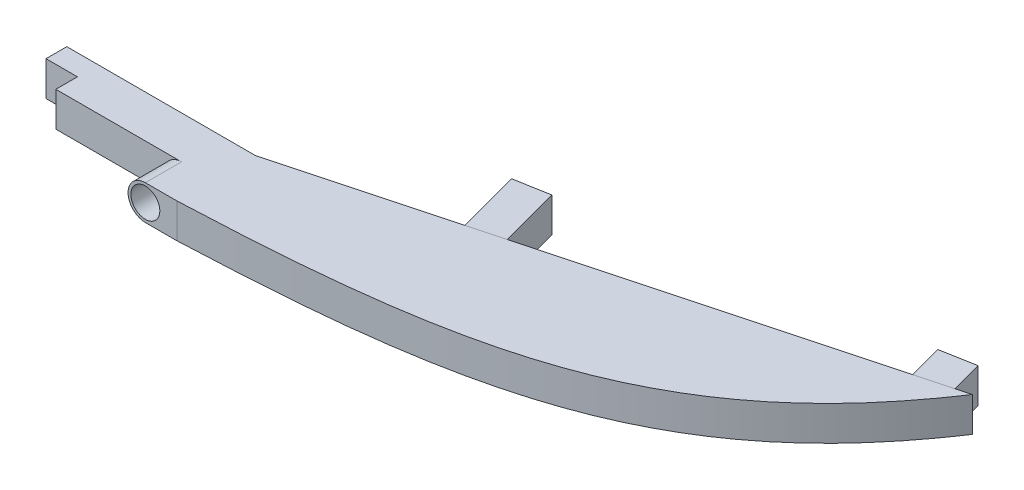
ISO-10303-21;
HEADER;
FILE_DESCRIPTION(('STEP AP214'),'2;1');
FILE_NAME('part.step','',(''),(''),'','','');
FILE_SCHEMA(('AUTOMOTIVE_DESIGN { 1 0 10303 214 1 1 1 1 }'));
ENDSEC;
DATA;
#1=APPLICATION_CONTEXT('core data for automotive mechanical design processes');
#2=APPLICATION_PROTOCOL_DEFINITION('international standard','automotive_design',2000,#1);
#3=PRODUCT_CONTEXT('',#1,'mechanical');
#4=PRODUCT('Part','Part','',(#3));
#5=PRODUCT_RELATED_PRODUCT_CATEGORY('part','',(#4));
#6=PRODUCT_DEFINITION_FORMATION('','',#4);
#7=PRODUCT_DEFINITION_CONTEXT('part definition',#1,'design');
#8=PRODUCT_DEFINITION('design','',#6,#7);
#9=PRODUCT_DEFINITION_SHAPE('','',#8);
#10=(LENGTH_UNIT() NAMED_UNIT(*) SI_UNIT(.MILLI.,.METRE.));
#11=(NAMED_UNIT(*) PLANE_ANGLE_UNIT() SI_UNIT($,.RADIAN.));
#12=(NAMED_UNIT(*) SI_UNIT($,.STERADIAN.) SOLID_ANGLE_UNIT());
#13=UNCERTAINTY_MEASURE_WITH_UNIT(LENGTH_MEASURE(1.E-05),#10,'distance_accuracy_value','');
#14=(GEOMETRIC_REPRESENTATION_CONTEXT(3) GLOBAL_UNCERTAINTY_ASSIGNED_CONTEXT((#13)) GLOBAL_UNIT_ASSIGNED_CONTEXT((#10,
#11,#12)) REPRESENTATION_CONTEXT('',''));
#15=CARTESIAN_POINT('',(0.,0.,0.));
#16=DIRECTION('',(0.,0.,1.));
#17=DIRECTION('',(1.,0.,0.));
#18=AXIS2_PLACEMENT_3D('',#15,#16,#17);
#19=CARTESIAN_POINT('',(-3.12500000003779,0.,-11.6626587736309));
#20=DIRECTION('',(-0.258819045105893,0.,-0.965925826288165));
#21=DIRECTION('',(-0.965925826288165,0.,0.258819045105893));
#22=AXIS2_PLACEMENT_3D('',#19,#20,#21);
#23=PLANE('',#22);
#24=DIRECTION('',(-0.965925826288165,0.,0.258819045105893));
#25=VECTOR('',#24,1.);
#26=CARTESIAN_POINT('',(-3.12500000003779,5.5,-11.6626587736309));
#27=LINE('',#26,#25);
#28=CARTESIAN_POINT('',(31.6340708109374,5.5,-20.976323727218));
#29=VERTEX_POINT('',#28);
#30=CARTESIAN_POINT('',(26.3214787663525,5.5,-19.5528189791356));
#31=VERTEX_POINT('',#30);
#32=EDGE_CURVE('E110',#29,#31,#27,.T.);
#33=ORIENTED_EDGE('',*,*,#32,.T.);
#34=DIRECTION('',(0.,1.,0.));
#35=VECTOR('',#34,1.);
#36=CARTESIAN_POINT('',(26.3214787663525,0.,-19.5528189791356));
#37=LINE('',#36,#35);
#38=CARTESIAN_POINT('',(26.3214787663525,0.,-19.5528189791356));
#39=VERTEX_POINT('',#38);
#40=EDGE_CURVE('E12',#39,#31,#37,.T.);
#41=ORIENTED_EDGE('',*,*,#40,.F.);
#42=DIRECTION('',(-0.965925826288165,0.,0.258819045105893));
#43=VECTOR('',#42,1.);
#44=CARTESIAN_POINT('',(-3.12500000003779,0.,-11.6626587736309));
#45=LINE('',#44,#43);
#46=CARTESIAN_POINT('',(31.6340708109374,0.,-20.976323727218));
#47=VERTEX_POINT('',#46);
#48=EDGE_CURVE('E105',#47,#39,#45,.T.);
#49=ORIENTED_EDGE('',*,*,#48,.F.);
#50=DIRECTION('',(0.,1.,0.));
#51=VECTOR('',#50,1.);
#52=CARTESIAN_POINT('',(31.6340708109374,0.,-20.976323727218));
#53=LINE('',#52,#51);
#54=EDGE_CURVE('E49',#47,#29,#53,.T.);
#55=ORIENTED_EDGE('',*,*,#54,.T.);
#56=EDGE_LOOP('',(#33,#41,#49,#55));
#57=FACE_BOUND('',#56,.T.);
#58=ADVANCED_FACE('F46',(#57),#23,.F.);
#59=CARTESIAN_POINT('',(29.4464787663903,0.,-7.89016020550466));
#60=DIRECTION('',(0.965925826288165,0.,-0.258819045105893));
#61=DIRECTION('',(-0.258819045105893,0.,-0.965925826288165));
#62=AXIS2_PLACEMENT_3D('',#59,#60,#61);
#63=PLANE('',#62);
#64=DIRECTION('',(-0.258819045105893,0.,-0.965925826288165));
#65=VECTOR('',#64,1.);
#66=CARTESIAN_POINT('',(29.4464787663903,5.5,-7.89016020550466));
#67=LINE('',#66,#65);
#68=CARTESIAN_POINT('',(23.6067214539603,5.5,-29.6844311990608));
#69=VERTEX_POINT('',#68);
#70=EDGE_CURVE('E85',#31,#69,#67,.T.);
#71=ORIENTED_EDGE('',*,*,#70,.T.);
#72=DIRECTION('',(0.,1.,0.));
#73=VECTOR('',#72,1.);
#74=CARTESIAN_POINT('',(23.6067214539603,0.,-29.6844311990608));
#75=LINE('',#74,#73);
#76=CARTESIAN_POINT('',(23.6067214539603,0.,-29.6844311990608));
#77=VERTEX_POINT('',#76);
#78=EDGE_CURVE('E55',#77,#69,#75,.T.);
#79=ORIENTED_EDGE('',*,*,#78,.F.);
#80=DIRECTION('',(-0.258819045105893,0.,-0.965925826288165));
#81=VECTOR('',#80,1.);
#82=CARTESIAN_POINT('',(29.4464787663903,0.,-7.89016020550466));
#83=LINE('',#82,#81);
#84=EDGE_CURVE('E63',#39,#77,#83,.T.);
#85=ORIENTED_EDGE('',*,*,#84,.F.);
#86=ORIENTED_EDGE('',*,*,#40,.T.);
#87=EDGE_LOOP('',(#71,#79,#85,#86));
#88=FACE_BOUND('',#87,.T.);
#89=ADVANCED_FACE('F117',(#88),#63,.F.);
#90=CARTESIAN_POINT('',(-4.44710939388558,0.,-24.6163093787516));
#91=DIRECTION('',(-0.177779237001607,0.,-0.984070395292495));
#92=DIRECTION('',(-0.984070395292495,0.,0.177779237001607));
#93=AXIS2_PLACEMENT_3D('',#90,#91,#92);
#94=PLANE('',#93);
#95=DIRECTION('',(-0.984070395292495,0.,0.177779237001607));
#96=VECTOR('',#95,1.);
#97=CARTESIAN_POINT('',(-4.44710939388558,5.5,-24.6163093787516));
#98=LINE('',#97,#96);
#99=CARTESIAN_POINT('',(29.0378369496948,5.5,-30.6656004055709));
#100=VERTEX_POINT('',#99);
#101=EDGE_CURVE('E97',#100,#69,#98,.T.);
#102=ORIENTED_EDGE('',*,*,#101,.F.);
#103=DIRECTION('',(0.,1.,0.));
#104=VECTOR('',#103,1.);
#105=CARTESIAN_POINT('',(29.0378369496948,0.,-30.6656004055709));
#106=LINE('',#105,#104);
#107=CARTESIAN_POINT('',(29.0378369496948,0.,-30.6656004055709));
#108=VERTEX_POINT('',#107);
#109=EDGE_CURVE('E93',#108,#100,#106,.T.);
#110=ORIENTED_EDGE('',*,*,#109,.F.);
#111=DIRECTION('',(-0.984070395292495,0.,0.177779237001607));
#112=VECTOR('',#111,1.);
#113=CARTESIAN_POINT('',(-4.44710939388558,0.,-24.6163093787516));
#114=LINE('',#113,#112);
#115=EDGE_CURVE('E96',#108,#77,#114,.T.);
#116=ORIENTED_EDGE('',*,*,#115,.T.);
#117=ORIENTED_EDGE('',*,*,#78,.T.);
#118=EDGE_LOOP('',(#102,#110,#116,#117));
#119=FACE_BOUND('',#118,.T.);
#120=ADVANCED_FACE('F95',(#119),#94,.T.);
#121=CARTESIAN_POINT('',(34.7590708109752,0.,-9.31366495358706));
#122=DIRECTION('',(0.965925826288165,0.,-0.258819045105893));
#123=DIRECTION('',(-0.258819045105893,0.,-0.965925826288165));
#124=AXIS2_PLACEMENT_3D('',#121,#122,#123);
#125=PLANE('',#124);
#126=DIRECTION('',(-0.258819045105893,0.,-0.965925826288165));
#127=VECTOR('',#126,1.);
#128=CARTESIAN_POINT('',(34.7590708109752,5.5,-9.31366495358706));
#129=LINE('',#128,#127);
#130=EDGE_CURVE('E113',#29,#100,#129,.T.);
#131=ORIENTED_EDGE('',*,*,#130,.F.);
#132=ORIENTED_EDGE('',*,*,#54,.F.);
#133=DIRECTION('',(-0.258819045105893,0.,-0.965925826288165));
#134=VECTOR('',#133,1.);
#135=CARTESIAN_POINT('',(34.7590708109752,0.,-9.31366495358706));
#136=LINE('',#135,#134);
#137=EDGE_CURVE('E102',#47,#108,#136,.T.);
#138=ORIENTED_EDGE('',*,*,#137,.T.);
#139=ORIENTED_EDGE('',*,*,#109,.T.);
#140=EDGE_LOOP('',(#131,#132,#138,#139));
#141=FACE_BOUND('',#140,.T.);
#142=ADVANCED_FACE('F104',(#141),#125,.T.);
#143=CARTESIAN_POINT('',(0.,0.,0.));
#144=DIRECTION('',(0.,1.,0.));
#145=DIRECTION('',(0.,0.,1.));
#146=AXIS2_PLACEMENT_3D('',#143,#144,#145);
#147=PLANE('',#146);
#148=ORIENTED_EDGE('',*,*,#48,.T.);
#149=ORIENTED_EDGE('',*,*,#84,.T.);
#150=ORIENTED_EDGE('',*,*,#115,.F.);
#151=ORIENTED_EDGE('',*,*,#137,.F.);
#152=EDGE_LOOP('',(#148,#149,#150,#151));
#153=FACE_BOUND('',#152,.T.);
#154=ADVANCED_FACE('F101',(#153),#147,.F.);
#155=CARTESIAN_POINT('',(0.,5.5,0.));
#156=DIRECTION('',(0.,1.,0.));
#157=DIRECTION('',(0.,0.,1.));
#158=AXIS2_PLACEMENT_3D('',#155,#156,#157);
#159=PLANE('',#158);
#160=ORIENTED_EDGE('',*,*,#32,.F.);
#161=ORIENTED_EDGE('',*,*,#130,.T.);
#162=ORIENTED_EDGE('',*,*,#101,.T.);
#163=ORIENTED_EDGE('',*,*,#70,.F.);
#164=EDGE_LOOP('',(#160,#161,#162,#163));
#165=FACE_BOUND('',#164,.T.);
#166=ADVANCED_FACE('F119',(#165),#159,.T.);
#167=CLOSED_SHELL('',(#58,#89,#120,#142,#154,#166));
#168=MANIFOLD_SOLID_BREP('B2',#167);
#169=CARTESIAN_POINT('',(85.6390748463045,0.,-22.9469209459362));
#170=DIRECTION('',(0.965925826288165,0.,-0.258819045105893));
#171=DIRECTION('',(-0.258819045105893,0.,-0.965925826288165));
#172=AXIS2_PLACEMENT_3D('',#169,#170,#171);
#173=PLANE('',#172);
#174=DIRECTION('',(-0.258819045105893,0.,-0.965925826288165));
#175=VECTOR('',#174,1.);
#176=CARTESIAN_POINT('',(85.6390748463045,5.5,-22.9469209459362));
#177=LINE('',#176,#175);
#178=CARTESIAN_POINT('',(82.5140748462667,5.5,-34.6095797195671));
#179=VERTEX_POINT('',#178);
#180=CARTESIAN_POINT('',(81.0529693032083,5.5,-40.0624998414052));
#181=VERTEX_POINT('',#180);
#182=EDGE_CURVE('E247',#179,#181,#177,.T.);
#183=ORIENTED_EDGE('',*,*,#182,.T.);
#184=DIRECTION('',(0.,1.,0.));
#185=VECTOR('',#184,1.);
#186=CARTESIAN_POINT('',(81.0529693032083,0.,-40.0624998414052));
#187=LINE('',#186,#185);
#188=CARTESIAN_POINT('',(81.0529693032083,0.,-40.0624998414052));
#189=VERTEX_POINT('',#188);
#190=EDGE_CURVE('E44',#189,#181,#187,.T.);
#191=ORIENTED_EDGE('',*,*,#190,.F.);
#192=DIRECTION('',(-0.258819045105893,0.,-0.965925826288165));
#193=VECTOR('',#192,1.);
#194=CARTESIAN_POINT('',(85.6390748463045,0.,-22.9469209459362));
#195=LINE('',#194,#193);
#196=CARTESIAN_POINT('',(82.5140748462667,0.,-34.6095797195671));
#197=VERTEX_POINT('',#196);
#198=EDGE_CURVE('E203',#197,#189,#195,.T.);
#199=ORIENTED_EDGE('',*,*,#198,.F.);
#200=DIRECTION('',(0.,1.,0.));
#201=VECTOR('',#200,1.);
#202=CARTESIAN_POINT('',(82.5140748462667,0.,-34.6095797195671));
#203=LINE('',#202,#201);
#204=EDGE_CURVE('E188',#197,#179,#203,.T.);
#205=ORIENTED_EDGE('',*,*,#204,.T.);
#206=EDGE_LOOP('',(#183,#191,#199,#205));
#207=FACE_BOUND('',#206,.T.);
#208=ADVANCED_FACE('F185',(#207),#173,.F.);
#209=CARTESIAN_POINT('',(-4.44710939388558,0.,-24.6163093787516));
#210=DIRECTION('',(-0.177779237001607,0.,-0.984070395292495));
#211=DIRECTION('',(-0.984070395292495,0.,0.177779237001607));
#212=AXIS2_PLACEMENT_3D('',#209,#210,#211);
#213=PLANE('',#212);
#214=DIRECTION('',(-0.984070395292495,0.,0.177779237001607));
#215=VECTOR('',#214,1.);
#216=CARTESIAN_POINT('',(-4.44710939388558,5.5,-24.6163093787516));
#217=LINE('',#216,#215);
#218=CARTESIAN_POINT('',(86.4840847989428,5.5,-41.0436690479154));
#219=VERTEX_POINT('',#218);
#220=EDGE_CURVE('E252',#219,#181,#217,.T.);
#221=ORIENTED_EDGE('',*,*,#220,.F.);
#222=DIRECTION('',(0.,1.,0.));
#223=VECTOR('',#222,1.);
#224=CARTESIAN_POINT('',(86.4840847989428,0.,-41.0436690479154));
#225=LINE('',#224,#223);
#226=CARTESIAN_POINT('',(86.4840847989428,0.,-41.0436690479154));
#227=VERTEX_POINT('',#226);
#228=EDGE_CURVE('E194',#227,#219,#225,.T.);
#229=ORIENTED_EDGE('',*,*,#228,.F.);
#230=DIRECTION('',(-0.984070395292495,0.,0.177779237001607));
#231=VECTOR('',#230,1.);
#232=CARTESIAN_POINT('',(-4.44710939388558,0.,-24.6163093787516));
#233=LINE('',#232,#231);
#234=EDGE_CURVE('E242',#227,#189,#233,.T.);
#235=ORIENTED_EDGE('',*,*,#234,.T.);
#236=ORIENTED_EDGE('',*,*,#190,.T.);
#237=EDGE_LOOP('',(#221,#229,#235,#236));
#238=FACE_BOUND('',#237,.T.);
#239=ADVANCED_FACE('F258',(#238),#213,.T.);
#240=CARTESIAN_POINT('',(90.9516668908894,0.,-24.3704256940185));
#241=DIRECTION('',(0.965925826288165,0.,-0.258819045105892));
#242=DIRECTION('',(-0.258819045105892,0.,-0.965925826288165));
#243=AXIS2_PLACEMENT_3D('',#240,#241,#242);
#244=PLANE('',#243);
#245=DIRECTION('',(-0.258819045105892,0.,-0.965925826288165));
#246=VECTOR('',#245,1.);
#247=CARTESIAN_POINT('',(90.9516668908894,5.5,-24.3704256940185));
#248=LINE('',#247,#246);
#249=CARTESIAN_POINT('',(87.8266668908516,5.5,-36.0330844676495));
#250=VERTEX_POINT('',#249);
#251=EDGE_CURVE('E235',#250,#219,#248,.T.);
#252=ORIENTED_EDGE('',*,*,#251,.F.);
#253=DIRECTION('',(0.,1.,0.));
#254=VECTOR('',#253,1.);
#255=CARTESIAN_POINT('',(87.8266668908516,0.,-36.0330844676495));
#256=LINE('',#255,#254);
#257=CARTESIAN_POINT('',(87.8266668908516,0.,-36.0330844676495));
#258=VERTEX_POINT('',#257);
#259=EDGE_CURVE('E232',#258,#250,#256,.T.);
#260=ORIENTED_EDGE('',*,*,#259,.F.);
#261=DIRECTION('',(-0.258819045105892,0.,-0.965925826288165));
#262=VECTOR('',#261,1.);
#263=CARTESIAN_POINT('',(90.9516668908894,0.,-24.3704256940185));
#264=LINE('',#263,#262);
#265=EDGE_CURVE('E234',#258,#227,#264,.T.);
#266=ORIENTED_EDGE('',*,*,#265,.T.);
#267=ORIENTED_EDGE('',*,*,#228,.T.);
#268=EDGE_LOOP('',(#252,#260,#266,#267));
#269=FACE_BOUND('',#268,.T.);
#270=ADVANCED_FACE('F233',(#269),#244,.T.);
#271=CARTESIAN_POINT('',(-3.12500000003779,0.,-11.6626587736309));
#272=DIRECTION('',(-0.258819045105893,0.,-0.965925826288165));
#273=DIRECTION('',(-0.965925826288165,0.,0.258819045105893));
#274=AXIS2_PLACEMENT_3D('',#271,#272,#273);
#275=PLANE('',#274);
#276=DIRECTION('',(-0.965925826288165,0.,0.258819045105893));
#277=VECTOR('',#276,1.);
#278=CARTESIAN_POINT('',(-3.12500000003779,5.5,-11.6626587736309));
#279=LINE('',#278,#277);
#280=EDGE_CURVE('E249',#250,#179,#279,.T.);
#281=ORIENTED_EDGE('',*,*,#280,.T.);
#282=ORIENTED_EDGE('',*,*,#204,.F.);
#283=DIRECTION('',(-0.965925826288165,0.,0.258819045105893));
#284=VECTOR('',#283,1.);
#285=CARTESIAN_POINT('',(-3.12500000003779,0.,-11.6626587736309));
#286=LINE('',#285,#284);
#287=EDGE_CURVE('E229',#258,#197,#286,.T.);
#288=ORIENTED_EDGE('',*,*,#287,.F.);
#289=ORIENTED_EDGE('',*,*,#259,.T.);
#290=EDGE_LOOP('',(#281,#282,#288,#289));
#291=FACE_BOUND('',#290,.T.);
#292=ADVANCED_FACE('F238',(#291),#275,.F.);
#293=CARTESIAN_POINT('',(0.,0.,0.));
#294=DIRECTION('',(0.,1.,0.));
#295=DIRECTION('',(0.,0.,1.));
#296=AXIS2_PLACEMENT_3D('',#293,#294,#295);
#297=PLANE('',#296);
#298=ORIENTED_EDGE('',*,*,#198,.T.);
#299=ORIENTED_EDGE('',*,*,#234,.F.);
#300=ORIENTED_EDGE('',*,*,#265,.F.);
#301=ORIENTED_EDGE('',*,*,#287,.T.);
#302=EDGE_LOOP('',(#298,#299,#300,#301));
#303=FACE_BOUND('',#302,.T.);
#304=ADVANCED_FACE('F241',(#303),#297,.F.);
#305=CARTESIAN_POINT('',(0.,5.5,0.));
#306=DIRECTION('',(0.,1.,0.));
#307=DIRECTION('',(0.,0.,1.));
#308=AXIS2_PLACEMENT_3D('',#305,#306,#307);
#309=PLANE('',#308);
#310=ORIENTED_EDGE('',*,*,#182,.F.);
#311=ORIENTED_EDGE('',*,*,#280,.F.);
#312=ORIENTED_EDGE('',*,*,#251,.T.);
#313=ORIENTED_EDGE('',*,*,#220,.T.);
#314=EDGE_LOOP('',(#310,#311,#312,#313));
#315=FACE_BOUND('',#314,.T.);
#316=ADVANCED_FACE('F257',(#315),#309,.T.);
#317=CLOSED_SHELL('',(#208,#239,#270,#292,#304,#316));
#318=MANIFOLD_SOLID_BREP('B6',#317);
#319=CARTESIAN_POINT('',(0.,5.5,0.));
#320=DIRECTION('',(0.,1.,0.));
#321=DIRECTION('',(0.,0.,1.));
#322=AXIS2_PLACEMENT_3D('',#319,#320,#321);
#323=PLANE('',#322);
#324=DIRECTION('',(-1.,0.,0.));
#325=VECTOR('',#324,1.);
#326=CARTESIAN_POINT('',(0.,5.5,-5.75));
#327=LINE('',#326,#325);
#328=CARTESIAN_POINT('',(-5.,5.5,-5.75));
#329=VERTEX_POINT('',#328);
#330=CARTESIAN_POINT('',(-25.,5.5,-5.75));
#331=VERTEX_POINT('',#330);
#332=EDGE_CURVE('E341',#329,#331,#327,.T.);
#333=ORIENTED_EDGE('',*,*,#332,.F.);
#334=DIRECTION('',(0.,0.,1.));
#335=VECTOR('',#334,1.);
#336=CARTESIAN_POINT('',(-5.,5.5,-5.75));
#337=LINE('',#336,#335);
#338=CARTESIAN_POINT('',(-5.,5.5,0.));
#339=VERTEX_POINT('',#338);
#340=EDGE_CURVE('E492',#329,#339,#337,.T.);
#341=ORIENTED_EDGE('',*,*,#340,.T.);
#342=DIRECTION('',(1.,0.,0.));
#343=VECTOR('',#342,1.);
#344=CARTESIAN_POINT('',(-25.,5.5,0.));
#345=LINE('',#344,#343);
#346=CARTESIAN_POINT('',(0.,5.5,0.));
#347=VERTEX_POINT('',#346);
#348=EDGE_CURVE('E441',#339,#347,#345,.T.);
#349=ORIENTED_EDGE('',*,*,#348,.T.);
#350=CARTESIAN_POINT('',(-3.99701542976772E-10,5.5,1.60987063267593E-11));
#351=CARTESIAN_POINT('',(0.391394635243987,5.5,-0.0157750053797903));
#352=CARTESIAN_POINT('',(1.18697403500994,5.5,-0.0487759685721944));
#353=CARTESIAN_POINT('',(2.97371886532466,5.5,-0.125104104098016));
#354=CARTESIAN_POINT('',(4.54008890350178,5.5,-0.200260299116027));
#355=CARTESIAN_POINT('',(6.56661566228479,5.5,-0.300718996412045));
#356=CARTESIAN_POINT('',(8.32527633580625,5.5,-0.397659311451367));
#357=CARTESIAN_POINT('',(10.2393452977797,5.5,-0.508699866994759));
#358=CARTESIAN_POINT('',(12.0656989604106,5.5,-0.624646024555069));
#359=CARTESIAN_POINT('',(14.40145764918,5.5,-0.783062706143124));
#360=CARTESIAN_POINT('',(17.1745755641682,5.5,-0.991527453441799));
#361=CARTESIAN_POINT('',(20.424315772466,5.5,-1.26709563175987));
#362=CARTESIAN_POINT('',(24.1240411308153,5.5,-1.63189072491645));
#363=CARTESIAN_POINT('',(28.7464994471539,5.5,-2.16058829893543));
#364=CARTESIAN_POINT('',(34.1867170255386,5.5,-2.91640899189201));
#365=CARTESIAN_POINT('',(39.5992056703536,5.5,-3.86946359541546));
#366=CARTESIAN_POINT('',(44.9594427783575,5.5,-5.07707429287321));
#367=CARTESIAN_POINT('',(49.3618158266038,5.5,-6.28041823104868));
#368=CARTESIAN_POINT('',(52.9106920919481,5.5,-7.40087892256267));
#369=CARTESIAN_POINT('',(56.4081688521761,5.5,-8.67392879261675));
#370=CARTESIAN_POINT('',(59.8414498968872,5.5,-10.1114509716341));
#371=CARTESIAN_POINT('',(63.1969179772328,5.5,-11.7229728519031));
#372=CARTESIAN_POINT('',(66.4599871789213,5.5,-13.5144576410817));
#373=CARTESIAN_POINT('',(69.6166694042394,5.5,-15.487724176846));
#374=CARTESIAN_POINT('',(72.6542167339057,5.5,-17.6397938307028));
#375=CARTESIAN_POINT('',(75.5626334687585,5.5,-19.9635545523168));
#376=CARTESIAN_POINT('',(78.4114017746989,5.5,-22.5164023394282));
#377=CARTESIAN_POINT('',(80.637238298566,5.5,-24.7501277094886));
#378=CARTESIAN_POINT('',(82.3142030197585,5.5,-26.5768651787128));
#379=CARTESIAN_POINT('',(83.5001747606079,5.5,-27.9419093881025));
#380=CARTESIAN_POINT('',(84.1664515213518,5.5,-28.7295443987983));
#381=CARTESIAN_POINT('',(84.8247205965813,5.5,-29.5294985845606));
#382=CARTESIAN_POINT('',(85.4679017851143,5.5,-30.3305725761852));
#383=CARTESIAN_POINT('',(86.1096180697003,5.5,-31.152932898829));
#384=CARTESIAN_POINT('',(86.7258248018456,5.5,-31.9596372628073));
#385=CARTESIAN_POINT('',(87.3592157753844,5.5,-32.8149139023531));
#386=CARTESIAN_POINT('',(87.9353037158166,5.5,-33.6053343053545));
#387=CARTESIAN_POINT('',(88.5853514629931,5.5,-34.5293993999494));
#388=CARTESIAN_POINT('',(89.0772563702062,5.5,-35.2347214328894));
#389=CARTESIAN_POINT('',(89.639386065092,5.5,-36.0720039579726));
#390=CARTESIAN_POINT('',(89.8802416271091,5.5,-36.4338646602888));
#391=CARTESIAN_POINT('',(89.9999999999999,5.5,-36.6154273191376));
#392=B_SPLINE_CURVE_WITH_KNOTS('',4,(#350,#351,#352,#353,#354,#355,#356,#357,#358,#359,#360,
#361,#362,#363,#364,#365,#366,#367,#368,#369,#370,#371,#372,#373,#374,#375,#376,#377,#378,#379,
#380,#381,#382,#383,#384,#385,#386,#387,#388,#389,#390,#391),.UNSPECIFIED.,.F.,.F.,(5,1,1,1,1,1,
1,1,1,1,1,1,1,1,1,1,1,1,1,1,1,1,1,1,1,1,1,1,1,1,1,1,1,1,1,1,1,1,5),(0.0745428257623953,
0.0899420051313668,0.105341184500338,0.12074036386931,0.136139543238281,0.151538722821234,
0.166937902404187,0.18233708198714,0.197736261570092,0.22853461972874,0.259332977887387,
0.290131334919768,0.320929691952149,0.382526405312846,0.441205382352089,0.472003704326887,
0.502802054328003,0.533600415642708,0.564398766278646,0.595197066314678,0.62599542278122,
0.656793871998032,0.687592091282058,0.718390432587616,0.749188737095499,0.779987362687061,
0.814189108794913,0.82273965192033,0.831290195045747,0.839840738171165,0.848391281296582,
0.856941795912113,0.865492310527644,0.874042825143175,0.882593339758706,0.891143874173129,
0.899694408587551,0.908244943001974,0.916795477416396),.UNSPECIFIED.);
#393=CARTESIAN_POINT('',(90.,5.5,-36.6154273191378));
#394=VERTEX_POINT('',#393);
#395=EDGE_CURVE('E443',#347,#394,#392,.T.);
#396=ORIENTED_EDGE('',*,*,#395,.T.);
#397=DIRECTION('',(0.965925826288165,0.,-0.258819045105893));
#398=VECTOR('',#397,1.);
#399=CARTESIAN_POINT('',(-3.12500000003779,5.5,-11.6626587736309));
#400=LINE('',#399,#398);
#401=CARTESIAN_POINT('',(0.,5.5,-12.5));
#402=VERTEX_POINT('',#401);
#403=EDGE_CURVE('E448',#402,#394,#400,.T.);
#404=ORIENTED_EDGE('',*,*,#403,.F.);
#405=DIRECTION('',(1.,0.,0.));
#406=VECTOR('',#405,1.);
#407=CARTESIAN_POINT('',(-25.,5.5,-12.5));
#408=LINE('',#407,#406);
#409=CARTESIAN_POINT('',(-30.,5.5,-12.5));
#410=VERTEX_POINT('',#409);
#411=EDGE_CURVE('E404',#410,#402,#408,.T.);
#412=ORIENTED_EDGE('',*,*,#411,.F.);
#413=DIRECTION('',(0.,0.,-1.));
#414=VECTOR('',#413,1.);
#415=CARTESIAN_POINT('',(-30.,5.5,0.));
#416=LINE('',#415,#414);
#417=CARTESIAN_POINT('',(-30.,5.5,-9.1875));
#418=VERTEX_POINT('',#417);
#419=EDGE_CURVE('E401',#418,#410,#416,.T.);
#420=ORIENTED_EDGE('',*,*,#419,.F.);
#421=DIRECTION('',(1.,0.,0.));
#422=VECTOR('',#421,1.);
#423=CARTESIAN_POINT('',(-30.,5.5,-9.1875));
#424=LINE('',#423,#422);
#425=CARTESIAN_POINT('',(-25.,5.5,-9.1875));
#426=VERTEX_POINT('',#425);
#427=EDGE_CURVE('E390',#418,#426,#424,.T.);
#428=ORIENTED_EDGE('',*,*,#427,.T.);
#429=DIRECTION('',(0.,0.,-1.));
#430=VECTOR('',#429,1.);
#431=CARTESIAN_POINT('',(-25.,5.5,-12.5));
#432=LINE('',#431,#430);
#433=EDGE_CURVE('E430',#331,#426,#432,.T.);
#434=ORIENTED_EDGE('',*,*,#433,.F.);
#435=EDGE_LOOP('',(#333,#341,#349,#396,#404,#412,#420,#428,#434));
#436=FACE_BOUND('',#435,.T.);
#437=ADVANCED_FACE('F315',(#436),#323,.T.);
#438=CARTESIAN_POINT('',(0.,0.,0.));
#439=DIRECTION('',(0.,1.,0.));
#440=DIRECTION('',(0.,0.,1.));
#441=AXIS2_PLACEMENT_3D('',#438,#439,#440);
#442=PLANE('',#441);
#443=DIRECTION('',(0.,0.,1.));
#444=VECTOR('',#443,1.);
#445=CARTESIAN_POINT('',(-5.,0.,-5.75));
#446=LINE('',#445,#444);
#447=CARTESIAN_POINT('',(-5.,0.,-5.75));
#448=VERTEX_POINT('',#447);
#449=CARTESIAN_POINT('',(-5.,0.,0.));
#450=VERTEX_POINT('',#449);
#451=EDGE_CURVE('E486',#448,#450,#446,.T.);
#452=ORIENTED_EDGE('',*,*,#451,.F.);
#453=DIRECTION('',(1.,0.,0.));
#454=VECTOR('',#453,1.);
#455=CARTESIAN_POINT('',(0.,0.,-5.75));
#456=LINE('',#455,#454);
#457=CARTESIAN_POINT('',(-25.,0.,-5.75));
#458=VERTEX_POINT('',#457);
#459=EDGE_CURVE('E489',#458,#448,#456,.T.);
#460=ORIENTED_EDGE('',*,*,#459,.F.);
#461=DIRECTION('',(0.,0.,1.));
#462=VECTOR('',#461,1.);
#463=CARTESIAN_POINT('',(-25.,0.,-12.5));
#464=LINE('',#463,#462);
#465=CARTESIAN_POINT('',(-25.,0.,-9.1875));
#466=VERTEX_POINT('',#465);
#467=EDGE_CURVE('E424',#466,#458,#464,.T.);
#468=ORIENTED_EDGE('',*,*,#467,.F.);
#469=DIRECTION('',(1.,0.,0.));
#470=VECTOR('',#469,1.);
#471=CARTESIAN_POINT('',(-30.,0.,-9.1875));
#472=LINE('',#471,#470);
#473=CARTESIAN_POINT('',(-30.,0.,-9.1875));
#474=VERTEX_POINT('',#473);
#475=EDGE_CURVE('E333',#474,#466,#472,.T.);
#476=ORIENTED_EDGE('',*,*,#475,.F.);
#477=DIRECTION('',(0.,0.,1.));
#478=VECTOR('',#477,1.);
#479=CARTESIAN_POINT('',(-30.,0.,0.));
#480=LINE('',#479,#478);
#481=CARTESIAN_POINT('',(-30.,0.,-12.5));
#482=VERTEX_POINT('',#481);
#483=EDGE_CURVE('E412',#482,#474,#480,.T.);
#484=ORIENTED_EDGE('',*,*,#483,.F.);
#485=DIRECTION('',(1.,0.,0.));
#486=VECTOR('',#485,1.);
#487=CARTESIAN_POINT('',(-25.,0.,-12.5));
#488=LINE('',#487,#486);
#489=CARTESIAN_POINT('',(0.,0.,-12.5));
#490=VERTEX_POINT('',#489);
#491=EDGE_CURVE('E437',#482,#490,#488,.T.);
#492=ORIENTED_EDGE('',*,*,#491,.T.);
#493=DIRECTION('',(0.965925826288165,0.,-0.258819045105893));
#494=VECTOR('',#493,1.);
#495=CARTESIAN_POINT('',(-3.12500000003779,0.,-11.6626587736309));
#496=LINE('',#495,#494);
#497=CARTESIAN_POINT('',(90.,0.,-36.6154273191378));
#498=VERTEX_POINT('',#497);
#499=EDGE_CURVE('E449',#490,#498,#496,.T.);
#500=ORIENTED_EDGE('',*,*,#499,.T.);
#501=CARTESIAN_POINT('',(-3.99701542976772E-10,0.,1.60987063267593E-11));
#502=CARTESIAN_POINT('',(0.391394635243987,0.,-0.0157750053797903));
#503=CARTESIAN_POINT('',(1.18697403500994,0.,-0.0487759685721944));
#504=CARTESIAN_POINT('',(2.97371886532466,0.,-0.125104104098016));
#505=CARTESIAN_POINT('',(4.54008890350178,0.,-0.200260299116027));
#506=CARTESIAN_POINT('',(6.56661566228479,0.,-0.300718996412045));
#507=CARTESIAN_POINT('',(8.32527633580625,0.,-0.397659311451367));
#508=CARTESIAN_POINT('',(10.2393452977797,0.,-0.508699866994759));
#509=CARTESIAN_POINT('',(12.0656989604106,0.,-0.624646024555069));
#510=CARTESIAN_POINT('',(14.40145764918,0.,-0.783062706143124));
#511=CARTESIAN_POINT('',(17.1745755641682,0.,-0.991527453441799));
#512=CARTESIAN_POINT('',(20.424315772466,0.,-1.26709563175987));
#513=CARTESIAN_POINT('',(24.1240411308153,0.,-1.63189072491645));
#514=CARTESIAN_POINT('',(28.7464994471539,0.,-2.16058829893543));
#515=CARTESIAN_POINT('',(34.1867170255386,0.,-2.91640899189201));
#516=CARTESIAN_POINT('',(39.5992056703536,0.,-3.86946359541546));
#517=CARTESIAN_POINT('',(44.9594427783575,0.,-5.07707429287321));
#518=CARTESIAN_POINT('',(49.3618158266038,0.,-6.28041823104868));
#519=CARTESIAN_POINT('',(52.9106920919481,0.,-7.40087892256267));
#520=CARTESIAN_POINT('',(56.4081688521761,0.,-8.67392879261675));
#521=CARTESIAN_POINT('',(59.8414498968872,0.,-10.1114509716341));
#522=CARTESIAN_POINT('',(63.1969179772328,0.,-11.7229728519031));
#523=CARTESIAN_POINT('',(66.4599871789213,0.,-13.5144576410817));
#524=CARTESIAN_POINT('',(69.6166694042394,0.,-15.487724176846));
#525=CARTESIAN_POINT('',(72.6542167339057,0.,-17.6397938307028));
#526=CARTESIAN_POINT('',(75.5626334687585,0.,-19.9635545523168));
#527=CARTESIAN_POINT('',(78.4114017746989,0.,-22.5164023394282));
#528=CARTESIAN_POINT('',(80.637238298566,0.,-24.7501277094886));
#529=CARTESIAN_POINT('',(82.3142030197585,0.,-26.5768651787128));
#530=CARTESIAN_POINT('',(83.5001747606079,0.,-27.9419093881025));
#531=CARTESIAN_POINT('',(84.1664515213518,0.,-28.7295443987983));
#532=CARTESIAN_POINT('',(84.8247205965813,0.,-29.5294985845606));
#533=CARTESIAN_POINT('',(85.4679017851143,0.,-30.3305725761852));
#534=CARTESIAN_POINT('',(86.1096180697003,0.,-31.152932898829));
#535=CARTESIAN_POINT('',(86.7258248018456,0.,-31.9596372628073));
#536=CARTESIAN_POINT('',(87.3592157753844,0.,-32.8149139023531));
#537=CARTESIAN_POINT('',(87.9353037158166,0.,-33.6053343053545));
#538=CARTESIAN_POINT('',(88.5853514629931,0.,-34.5293993999494));
#539=CARTESIAN_POINT('',(89.0772563702062,0.,-35.2347214328894));
#540=CARTESIAN_POINT('',(89.639386065092,0.,-36.0720039579726));
#541=CARTESIAN_POINT('',(89.8802416271091,0.,-36.4338646602888));
#542=CARTESIAN_POINT('',(89.9999999999999,0.,-36.6154273191376));
#543=B_SPLINE_CURVE_WITH_KNOTS('',4,(#501,#502,#503,#504,#505,#506,#507,#508,#509,#510,#511,
#512,#513,#514,#515,#516,#517,#518,#519,#520,#521,#522,#523,#524,#525,#526,#527,#528,#529,#530,
#531,#532,#533,#534,#535,#536,#537,#538,#539,#540,#541,#542),.UNSPECIFIED.,.F.,.F.,(5,1,1,1,1,1,
1,1,1,1,1,1,1,1,1,1,1,1,1,1,1,1,1,1,1,1,1,1,1,1,1,1,1,1,1,1,1,1,5),(0.0745428257623953,
0.0899420051313668,0.105341184500338,0.12074036386931,0.136139543238281,0.151538722821234,
0.166937902404187,0.18233708198714,0.197736261570092,0.22853461972874,0.259332977887387,
0.290131334919768,0.320929691952149,0.382526405312846,0.441205382352089,0.472003704326887,
0.502802054328003,0.533600415642708,0.564398766278646,0.595197066314678,0.62599542278122,
0.656793871998032,0.687592091282058,0.718390432587616,0.749188737095499,0.779987362687061,
0.814189108794913,0.82273965192033,0.831290195045747,0.839840738171165,0.848391281296582,
0.856941795912113,0.865492310527644,0.874042825143175,0.882593339758706,0.891143874173129,
0.899694408587551,0.908244943001974,0.916795477416396),.UNSPECIFIED.);
#544=CARTESIAN_POINT('',(0.,0.,0.));
#545=VERTEX_POINT('',#544);
#546=EDGE_CURVE('E442',#545,#498,#543,.T.);
#547=ORIENTED_EDGE('',*,*,#546,.F.);
#548=DIRECTION('',(1.,0.,0.));
#549=VECTOR('',#548,1.);
#550=CARTESIAN_POINT('',(-25.,0.,0.));
#551=LINE('',#550,#549);
#552=EDGE_CURVE('E429',#450,#545,#551,.T.);
#553=ORIENTED_EDGE('',*,*,#552,.F.);
#554=EDGE_LOOP('',(#452,#460,#468,#476,#484,#492,#500,#547,#553));
#555=FACE_BOUND('',#554,.T.);
#556=ADVANCED_FACE('F477',(#555),#442,.F.);
#557=CARTESIAN_POINT('',(-25.,0.,0.));
#558=DIRECTION('',(0.,0.,-1.));
#559=DIRECTION('',(0.,1.,0.));
#560=AXIS2_PLACEMENT_3D('',#557,#558,#559);
#561=PLANE('',#560);
#562=CARTESIAN_POINT('',(-5.,2.75,0.));
#563=DIRECTION('',(0.,0.,-1.));
#564=DIRECTION('',(-1.,0.,0.));
#565=AXIS2_PLACEMENT_3D('',#562,#563,#564);
#566=CIRCLE('',#565,2.3);
#567=CARTESIAN_POINT('',(-7.3,2.75,0.));
#568=VERTEX_POINT('',#567);
#569=EDGE_CURVE('E495',#568,#568,#566,.T.);
#570=ORIENTED_EDGE('',*,*,#569,.T.);
#571=EDGE_LOOP('',(#570));
#572=FACE_BOUND('',#571,.T.);
#573=CARTESIAN_POINT('',(-5.,2.75,0.));
#574=DIRECTION('',(0.,0.,1.));
#575=DIRECTION('',(1.,0.,0.));
#576=AXIS2_PLACEMENT_3D('',#573,#574,#575);
#577=CIRCLE('',#576,2.75);
#578=EDGE_CURVE('E399',#339,#450,#577,.T.);
#579=ORIENTED_EDGE('',*,*,#578,.T.);
#580=ORIENTED_EDGE('',*,*,#552,.T.);
#581=DIRECTION('',(0.,-1.,0.));
#582=VECTOR('',#581,1.);
#583=CARTESIAN_POINT('',(0.,5.5,0.));
#584=LINE('',#583,#582);
#585=EDGE_CURVE('E183',#347,#545,#584,.T.);
#586=ORIENTED_EDGE('',*,*,#585,.F.);
#587=ORIENTED_EDGE('',*,*,#348,.F.);
#588=EDGE_LOOP('',(#579,#580,#586,#587));
#589=FACE_BOUND('',#588,.T.);
#590=ADVANCED_FACE('F484',(#572,#589),#561,.F.);
#591=CARTESIAN_POINT('',(-25.,0.,0.));
#592=DIRECTION('',(1.,0.,0.));
#593=DIRECTION('',(0.,0.,-1.));
#594=AXIS2_PLACEMENT_3D('',#591,#592,#593);
#595=PLANE('',#594);
#596=ORIENTED_EDGE('',*,*,#433,.T.);
#597=DIRECTION('',(0.,-1.,0.));
#598=VECTOR('',#597,1.);
#599=CARTESIAN_POINT('',(-25.,0.,-9.1875));
#600=LINE('',#599,#598);
#601=EDGE_CURVE('E395',#426,#466,#600,.T.);
#602=ORIENTED_EDGE('',*,*,#601,.T.);
#603=ORIENTED_EDGE('',*,*,#467,.T.);
#604=DIRECTION('',(0.,-1.,0.));
#605=VECTOR('',#604,1.);
#606=CARTESIAN_POINT('',(-25.,0.,-5.75));
#607=LINE('',#606,#605);
#608=EDGE_CURVE('E505',#331,#458,#607,.T.);
#609=ORIENTED_EDGE('',*,*,#608,.F.);
#610=EDGE_LOOP('',(#596,#602,#603,#609));
#611=FACE_BOUND('',#610,.T.);
#612=ADVANCED_FACE('F504',(#611),#595,.F.);
#613=DIRECTION('',(0.,-1.,0.));
#614=VECTOR('',#613,1.);
#615=SURFACE_OF_LINEAR_EXTRUSION('',#392,#614);
#616=ORIENTED_EDGE('',*,*,#546,.T.);
#617=DIRECTION('',(0.,-1.,0.));
#618=VECTOR('',#617,1.);
#619=CARTESIAN_POINT('',(90.,5.5,-36.6154273191378));
#620=LINE('',#619,#618);
#621=EDGE_CURVE('E325',#394,#498,#620,.T.);
#622=ORIENTED_EDGE('',*,*,#621,.F.);
#623=ORIENTED_EDGE('',*,*,#395,.F.);
#624=ORIENTED_EDGE('',*,*,#585,.T.);
#625=EDGE_LOOP('',(#616,#622,#623,#624));
#626=FACE_BOUND('',#625,.T.);
#627=ADVANCED_FACE('F317',(#626),#615,.F.);
#628=CARTESIAN_POINT('',(-3.12500000003779,5.5,-11.6626587736309));
#629=DIRECTION('',(-0.258819045105893,0.,-0.965925826288165));
#630=DIRECTION('',(-0.965925826288165,0.,0.258819045105893));
#631=AXIS2_PLACEMENT_3D('',#628,#629,#630);
#632=PLANE('',#631);
#633=ORIENTED_EDGE('',*,*,#499,.F.);
#634=DIRECTION('',(0.,-1.,0.));
#635=VECTOR('',#634,1.);
#636=CARTESIAN_POINT('',(0.,5.5,-12.5));
#637=LINE('',#636,#635);
#638=EDGE_CURVE('E455',#402,#490,#637,.T.);
#639=ORIENTED_EDGE('',*,*,#638,.F.);
#640=ORIENTED_EDGE('',*,*,#403,.T.);
#641=ORIENTED_EDGE('',*,*,#621,.T.);
#642=EDGE_LOOP('',(#633,#639,#640,#641));
#643=FACE_BOUND('',#642,.T.);
#644=ADVANCED_FACE('F469',(#643),#632,.T.);
#645=CARTESIAN_POINT('',(-25.,0.,-12.5));
#646=DIRECTION('',(0.,0.,1.));
#647=DIRECTION('',(1.,0.,0.));
#648=AXIS2_PLACEMENT_3D('',#645,#646,#647);
#649=PLANE('',#648);
#650=CARTESIAN_POINT('',(-5.,2.75,-12.5));
#651=DIRECTION('',(0.,0.,-1.));
#652=DIRECTION('',(-1.,0.,0.));
#653=AXIS2_PLACEMENT_3D('',#650,#651,#652);
#654=CIRCLE('',#653,2.3);
#655=CARTESIAN_POINT('',(-7.3,2.75,-12.5));
#656=VERTEX_POINT('',#655);
#657=EDGE_CURVE('E491',#656,#656,#654,.T.);
#658=ORIENTED_EDGE('',*,*,#657,.F.);
#659=EDGE_LOOP('',(#658));
#660=FACE_BOUND('',#659,.T.);
#661=ORIENTED_EDGE('',*,*,#638,.T.);
#662=ORIENTED_EDGE('',*,*,#491,.F.);
#663=DIRECTION('',(0.,-1.,0.));
#664=VECTOR('',#663,1.);
#665=CARTESIAN_POINT('',(-30.,0.,-12.5));
#666=LINE('',#665,#664);
#667=EDGE_CURVE('E408',#410,#482,#666,.T.);
#668=ORIENTED_EDGE('',*,*,#667,.F.);
#669=ORIENTED_EDGE('',*,*,#411,.T.);
#670=EDGE_LOOP('',(#661,#662,#668,#669));
#671=FACE_BOUND('',#670,.T.);
#672=ADVANCED_FACE('F479',(#660,#671),#649,.F.);
#673=CARTESIAN_POINT('',(-5.,2.75,0.));
#674=DIRECTION('',(0.,0.,-1.));
#675=DIRECTION('',(-1.,0.,0.));
#676=AXIS2_PLACEMENT_3D('',#673,#674,#675);
#677=CYLINDRICAL_SURFACE('',#676,2.3);
#678=ORIENTED_EDGE('',*,*,#569,.F.);
#679=EDGE_LOOP('',(#678));
#680=FACE_BOUND('',#679,.T.);
#681=ORIENTED_EDGE('',*,*,#657,.T.);
#682=EDGE_LOOP('',(#681));
#683=FACE_BOUND('',#682,.T.);
#684=ADVANCED_FACE('F510',(#680,#683),#677,.F.);
#685=CARTESIAN_POINT('',(-5.,2.75,-5.75));
#686=DIRECTION('',(0.,0.,1.));
#687=DIRECTION('',(1.,0.,0.));
#688=AXIS2_PLACEMENT_3D('',#685,#686,#687);
#689=CYLINDRICAL_SURFACE('',#688,2.75);
#690=ORIENTED_EDGE('',*,*,#578,.F.);
#691=ORIENTED_EDGE('',*,*,#340,.F.);
#692=CARTESIAN_POINT('',(-5.,2.75,-5.75));
#693=DIRECTION('',(0.,0.,1.));
#694=DIRECTION('',(1.,0.,0.));
#695=AXIS2_PLACEMENT_3D('',#692,#693,#694);
#696=CIRCLE('',#695,2.75);
#697=EDGE_CURVE('E420',#329,#448,#696,.T.);
#698=ORIENTED_EDGE('',*,*,#697,.T.);
#699=ORIENTED_EDGE('',*,*,#451,.T.);
#700=EDGE_LOOP('',(#690,#691,#698,#699));
#701=FACE_BOUND('',#700,.T.);
#702=ADVANCED_FACE('F508',(#701),#689,.T.);
#703=CARTESIAN_POINT('',(0.,0.,-5.75));
#704=DIRECTION('',(0.,0.,1.));
#705=DIRECTION('',(1.,0.,0.));
#706=AXIS2_PLACEMENT_3D('',#703,#704,#705);
#707=PLANE('',#706);
#708=ORIENTED_EDGE('',*,*,#697,.F.);
#709=ORIENTED_EDGE('',*,*,#332,.T.);
#710=ORIENTED_EDGE('',*,*,#608,.T.);
#711=ORIENTED_EDGE('',*,*,#459,.T.);
#712=EDGE_LOOP('',(#708,#709,#710,#711));
#713=FACE_BOUND('',#712,.T.);
#714=ADVANCED_FACE('F507',(#713),#707,.T.);
#715=CARTESIAN_POINT('',(-30.,0.,-9.1875));
#716=DIRECTION('',(0.,0.,1.));
#717=DIRECTION('',(0.,-1.,0.));
#718=AXIS2_PLACEMENT_3D('',#715,#716,#717);
#719=PLANE('',#718);
#720=ORIENTED_EDGE('',*,*,#601,.F.);
#721=ORIENTED_EDGE('',*,*,#427,.F.);
#722=DIRECTION('',(0.,-1.,0.));
#723=VECTOR('',#722,1.);
#724=CARTESIAN_POINT('',(-30.,0.,-9.1875));
#725=LINE('',#724,#723);
#726=EDGE_CURVE('E394',#418,#474,#725,.T.);
#727=ORIENTED_EDGE('',*,*,#726,.T.);
#728=ORIENTED_EDGE('',*,*,#475,.T.);
#729=EDGE_LOOP('',(#720,#721,#727,#728));
#730=FACE_BOUND('',#729,.T.);
#731=ADVANCED_FACE('F392',(#730),#719,.T.);
#732=CARTESIAN_POINT('',(-30.,0.,0.));
#733=DIRECTION('',(-1.,0.,0.));
#734=DIRECTION('',(0.,0.,1.));
#735=AXIS2_PLACEMENT_3D('',#732,#733,#734);
#736=PLANE('',#735);
#737=ORIENTED_EDGE('',*,*,#726,.F.);
#738=ORIENTED_EDGE('',*,*,#419,.T.);
#739=ORIENTED_EDGE('',*,*,#667,.T.);
#740=ORIENTED_EDGE('',*,*,#483,.T.);
#741=EDGE_LOOP('',(#737,#738,#739,#740));
#742=FACE_BOUND('',#741,.T.);
#743=ADVANCED_FACE('F410',(#742),#736,.T.);
#744=CLOSED_SHELL('',(#437,#556,#590,#612,#627,#644,#672,#684,#702,#714,#731,#743));
#745=MANIFOLD_SOLID_BREP('B38',#744);
#746=ADVANCED_BREP_SHAPE_REPRESENTATION('',(#18,#168,#318,#745),#14);
#747=SHAPE_DEFINITION_REPRESENTATION(#9,#746);
ENDSEC;
END-ISO-10303-21;
